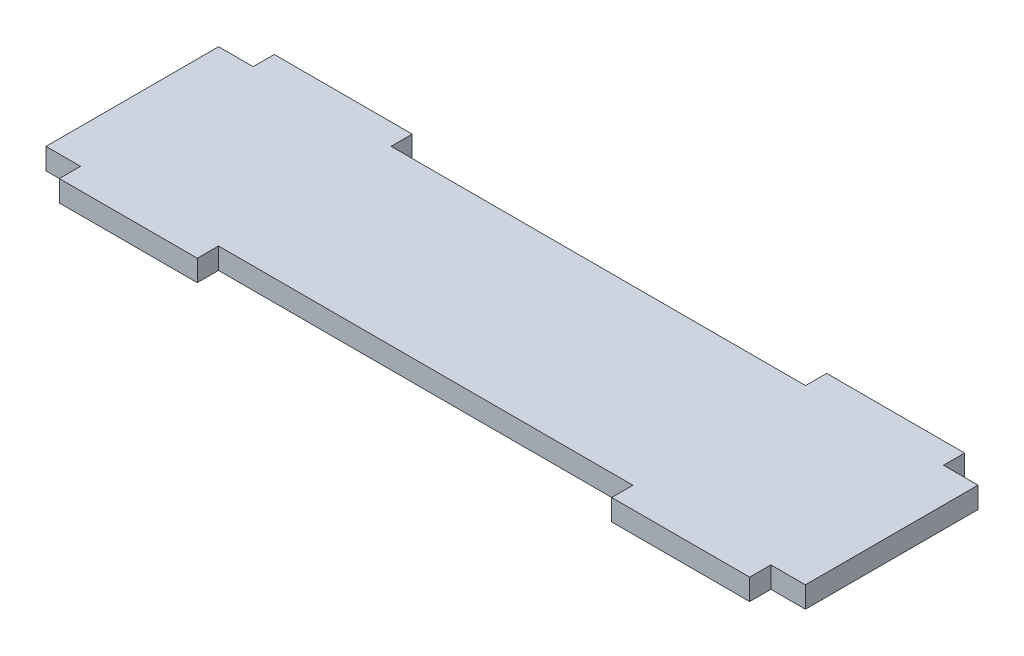
ISO-10303-21;
HEADER;
FILE_DESCRIPTION(('STEP AP214'),'2;1');
FILE_NAME('part.step','',(''),(''),'','','');
FILE_SCHEMA(('AUTOMOTIVE_DESIGN { 1 0 10303 214 1 1 1 1 }'));
ENDSEC;
DATA;
#1=APPLICATION_CONTEXT('core data for automotive mechanical design processes');
#2=APPLICATION_PROTOCOL_DEFINITION('international standard','automotive_design',2000,#1);
#3=PRODUCT_CONTEXT('',#1,'mechanical');
#4=PRODUCT('Part','Part','',(#3));
#5=PRODUCT_RELATED_PRODUCT_CATEGORY('part','',(#4));
#6=PRODUCT_DEFINITION_FORMATION('','',#4);
#7=PRODUCT_DEFINITION_CONTEXT('part definition',#1,'design');
#8=PRODUCT_DEFINITION('design','',#6,#7);
#9=PRODUCT_DEFINITION_SHAPE('','',#8);
#10=(LENGTH_UNIT() NAMED_UNIT(*) SI_UNIT(.MILLI.,.METRE.));
#11=(NAMED_UNIT(*) PLANE_ANGLE_UNIT() SI_UNIT($,.RADIAN.));
#12=(NAMED_UNIT(*) SI_UNIT($,.STERADIAN.) SOLID_ANGLE_UNIT());
#13=UNCERTAINTY_MEASURE_WITH_UNIT(LENGTH_MEASURE(1.E-05),#10,'distance_accuracy_value','');
#14=(GEOMETRIC_REPRESENTATION_CONTEXT(3) GLOBAL_UNCERTAINTY_ASSIGNED_CONTEXT((#13)) GLOBAL_UNIT_ASSIGNED_CONTEXT((#10,
#11,#12)) REPRESENTATION_CONTEXT('',''));
#15=CARTESIAN_POINT('',(0.,0.,0.));
#16=DIRECTION('',(0.,0.,1.));
#17=DIRECTION('',(1.,0.,0.));
#18=AXIS2_PLACEMENT_3D('',#15,#16,#17);
#19=CARTESIAN_POINT('',(-30.01,-51.9,-32.1299999999999));
#20=DIRECTION('',(0.,0.,1.));
#21=DIRECTION('',(1.,0.,0.));
#22=AXIS2_PLACEMENT_3D('',#19,#20,#21);
#23=PLANE('',#22);
#24=DIRECTION('',(1.,0.,0.));
#25=VECTOR('',#24,1.);
#26=CARTESIAN_POINT('',(-30.01,-48.83,-32.1299999999999));
#27=LINE('',#26,#25);
#28=CARTESIAN_POINT('',(-49.99,-48.83,-32.1299999999999));
#29=VERTEX_POINT('',#28);
#30=CARTESIAN_POINT('',(-30.01,-48.83,-32.1299999999999));
#31=VERTEX_POINT('',#30);
#32=EDGE_CURVE('E211',#29,#31,#27,.T.);
#33=ORIENTED_EDGE('',*,*,#32,.T.);
#34=DIRECTION('',(0.,1.,0.));
#35=VECTOR('',#34,1.);
#36=CARTESIAN_POINT('',(-30.01,-51.9,-32.1299999999999));
#37=LINE('',#36,#35);
#38=CARTESIAN_POINT('',(-30.01,-51.9,-32.1299999999999));
#39=VERTEX_POINT('',#38);
#40=EDGE_CURVE('E11',#39,#31,#37,.T.);
#41=ORIENTED_EDGE('',*,*,#40,.F.);
#42=DIRECTION('',(1.,0.,0.));
#43=VECTOR('',#42,1.);
#44=CARTESIAN_POINT('',(-30.01,-51.9,-32.1299999999999));
#45=LINE('',#44,#43);
#46=CARTESIAN_POINT('',(-49.99,-51.9,-32.1299999999999));
#47=VERTEX_POINT('',#46);
#48=EDGE_CURVE('E249',#47,#39,#45,.T.);
#49=ORIENTED_EDGE('',*,*,#48,.F.);
#50=DIRECTION('',(0.,1.,0.));
#51=VECTOR('',#50,1.);
#52=CARTESIAN_POINT('',(-49.99,-51.9,-32.1299999999999));
#53=LINE('',#52,#51);
#54=EDGE_CURVE('E207',#47,#29,#53,.T.);
#55=ORIENTED_EDGE('',*,*,#54,.T.);
#56=EDGE_LOOP('',(#33,#41,#49,#55));
#57=FACE_BOUND('',#56,.T.);
#58=ADVANCED_FACE('F43',(#57),#23,.F.);
#59=CARTESIAN_POINT('',(-30.01,-51.9,-29.07));
#60=DIRECTION('',(-1.,0.,0.));
#61=DIRECTION('',(0.,0.,1.));
#62=AXIS2_PLACEMENT_3D('',#59,#60,#61);
#63=PLANE('',#62);
#64=DIRECTION('',(0.,0.,1.));
#65=VECTOR('',#64,1.);
#66=CARTESIAN_POINT('',(-30.01,-48.83,-29.07));
#67=LINE('',#66,#65);
#68=CARTESIAN_POINT('',(-30.01,-48.83,-29.07));
#69=VERTEX_POINT('',#68);
#70=EDGE_CURVE('E214',#31,#69,#67,.T.);
#71=ORIENTED_EDGE('',*,*,#70,.T.);
#72=DIRECTION('',(0.,1.,0.));
#73=VECTOR('',#72,1.);
#74=CARTESIAN_POINT('',(-30.01,-51.9,-29.07));
#75=LINE('',#74,#73);
#76=CARTESIAN_POINT('',(-30.01,-51.9,-29.07));
#77=VERTEX_POINT('',#76);
#78=EDGE_CURVE('E51',#77,#69,#75,.T.);
#79=ORIENTED_EDGE('',*,*,#78,.F.);
#80=DIRECTION('',(0.,0.,1.));
#81=VECTOR('',#80,1.);
#82=CARTESIAN_POINT('',(-30.01,-51.9,-29.07));
#83=LINE('',#82,#81);
#84=EDGE_CURVE('E138',#39,#77,#83,.T.);
#85=ORIENTED_EDGE('',*,*,#84,.F.);
#86=ORIENTED_EDGE('',*,*,#40,.T.);
#87=EDGE_LOOP('',(#71,#79,#85,#86));
#88=FACE_BOUND('',#87,.T.);
#89=ADVANCED_FACE('F368',(#88),#63,.F.);
#90=CARTESIAN_POINT('',(30.01,-51.9,-29.07));
#91=DIRECTION('',(0.,0.,1.));
#92=DIRECTION('',(1.,0.,0.));
#93=AXIS2_PLACEMENT_3D('',#90,#91,#92);
#94=PLANE('',#93);
#95=DIRECTION('',(1.,0.,0.));
#96=VECTOR('',#95,1.);
#97=CARTESIAN_POINT('',(30.01,-48.83,-29.07));
#98=LINE('',#97,#96);
#99=CARTESIAN_POINT('',(30.01,-48.83,-29.07));
#100=VERTEX_POINT('',#99);
#101=EDGE_CURVE('E216',#69,#100,#98,.T.);
#102=ORIENTED_EDGE('',*,*,#101,.T.);
#103=DIRECTION('',(0.,1.,0.));
#104=VECTOR('',#103,1.);
#105=CARTESIAN_POINT('',(30.01,-51.9,-29.07));
#106=LINE('',#105,#104);
#107=CARTESIAN_POINT('',(30.01,-51.9,-29.07));
#108=VERTEX_POINT('',#107);
#109=EDGE_CURVE('E292',#108,#100,#106,.T.);
#110=ORIENTED_EDGE('',*,*,#109,.F.);
#111=DIRECTION('',(1.,0.,0.));
#112=VECTOR('',#111,1.);
#113=CARTESIAN_POINT('',(30.01,-51.9,-29.07));
#114=LINE('',#113,#112);
#115=EDGE_CURVE('E300',#77,#108,#114,.T.);
#116=ORIENTED_EDGE('',*,*,#115,.F.);
#117=ORIENTED_EDGE('',*,*,#78,.T.);
#118=EDGE_LOOP('',(#102,#110,#116,#117));
#119=FACE_BOUND('',#118,.T.);
#120=ADVANCED_FACE('F298',(#119),#94,.F.);
#121=CARTESIAN_POINT('',(30.01,-51.9,-32.1299999999999));
#122=DIRECTION('',(1.,0.,0.));
#123=DIRECTION('',(0.,0.,-1.));
#124=AXIS2_PLACEMENT_3D('',#121,#122,#123);
#125=PLANE('',#124);
#126=DIRECTION('',(0.,0.,-1.));
#127=VECTOR('',#126,1.);
#128=CARTESIAN_POINT('',(30.01,-48.83,-32.1299999999999));
#129=LINE('',#128,#127);
#130=CARTESIAN_POINT('',(30.01,-48.83,-32.1299999999999));
#131=VERTEX_POINT('',#130);
#132=EDGE_CURVE('E218',#100,#131,#129,.T.);
#133=ORIENTED_EDGE('',*,*,#132,.T.);
#134=DIRECTION('',(0.,1.,0.));
#135=VECTOR('',#134,1.);
#136=CARTESIAN_POINT('',(30.01,-51.9,-32.1299999999999));
#137=LINE('',#136,#135);
#138=CARTESIAN_POINT('',(30.01,-51.9,-32.1299999999999));
#139=VERTEX_POINT('',#138);
#140=EDGE_CURVE('E289',#139,#131,#137,.T.);
#141=ORIENTED_EDGE('',*,*,#140,.F.);
#142=DIRECTION('',(0.,0.,-1.));
#143=VECTOR('',#142,1.);
#144=CARTESIAN_POINT('',(30.01,-51.9,-32.1299999999999));
#145=LINE('',#144,#143);
#146=EDGE_CURVE('E318',#108,#139,#145,.T.);
#147=ORIENTED_EDGE('',*,*,#146,.F.);
#148=ORIENTED_EDGE('',*,*,#109,.T.);
#149=EDGE_LOOP('',(#133,#141,#147,#148));
#150=FACE_BOUND('',#149,.T.);
#151=ADVANCED_FACE('F309',(#150),#125,.F.);
#152=CARTESIAN_POINT('',(49.99,-51.9,-32.1299999999999));
#153=DIRECTION('',(0.,0.,1.));
#154=DIRECTION('',(1.,0.,0.));
#155=AXIS2_PLACEMENT_3D('',#152,#153,#154);
#156=PLANE('',#155);
#157=DIRECTION('',(1.,0.,0.));
#158=VECTOR('',#157,1.);
#159=CARTESIAN_POINT('',(49.99,-48.83,-32.1299999999999));
#160=LINE('',#159,#158);
#161=CARTESIAN_POINT('',(49.99,-48.83,-32.1299999999999));
#162=VERTEX_POINT('',#161);
#163=EDGE_CURVE('E220',#131,#162,#160,.T.);
#164=ORIENTED_EDGE('',*,*,#163,.T.);
#165=DIRECTION('',(0.,1.,0.));
#166=VECTOR('',#165,1.);
#167=CARTESIAN_POINT('',(49.99,-51.9,-32.1299999999999));
#168=LINE('',#167,#166);
#169=CARTESIAN_POINT('',(49.99,-51.9,-32.1299999999999));
#170=VERTEX_POINT('',#169);
#171=EDGE_CURVE('E286',#170,#162,#168,.T.);
#172=ORIENTED_EDGE('',*,*,#171,.F.);
#173=DIRECTION('',(1.,0.,0.));
#174=VECTOR('',#173,1.);
#175=CARTESIAN_POINT('',(49.99,-51.9,-32.1299999999999));
#176=LINE('',#175,#174);
#177=EDGE_CURVE('E315',#139,#170,#176,.T.);
#178=ORIENTED_EDGE('',*,*,#177,.F.);
#179=ORIENTED_EDGE('',*,*,#140,.T.);
#180=EDGE_LOOP('',(#164,#172,#178,#179));
#181=FACE_BOUND('',#180,.T.);
#182=ADVANCED_FACE('F313',(#181),#156,.F.);
#183=CARTESIAN_POINT('',(49.99,-51.9,-29.07));
#184=DIRECTION('',(-1.,0.,0.));
#185=DIRECTION('',(0.,0.,1.));
#186=AXIS2_PLACEMENT_3D('',#183,#184,#185);
#187=PLANE('',#186);
#188=DIRECTION('',(0.,0.,1.));
#189=VECTOR('',#188,1.);
#190=CARTESIAN_POINT('',(49.99,-48.83,-29.07));
#191=LINE('',#190,#189);
#192=CARTESIAN_POINT('',(49.99,-48.83,-29.07));
#193=VERTEX_POINT('',#192);
#194=EDGE_CURVE('E222',#162,#193,#191,.T.);
#195=ORIENTED_EDGE('',*,*,#194,.T.);
#196=DIRECTION('',(0.,1.,0.));
#197=VECTOR('',#196,1.);
#198=CARTESIAN_POINT('',(49.99,-51.9,-29.07));
#199=LINE('',#198,#197);
#200=CARTESIAN_POINT('',(49.99,-51.9,-29.07));
#201=VERTEX_POINT('',#200);
#202=EDGE_CURVE('E283',#201,#193,#199,.T.);
#203=ORIENTED_EDGE('',*,*,#202,.F.);
#204=DIRECTION('',(0.,0.,1.));
#205=VECTOR('',#204,1.);
#206=CARTESIAN_POINT('',(49.99,-51.9,-29.07));
#207=LINE('',#206,#205);
#208=EDGE_CURVE('E317',#170,#201,#207,.T.);
#209=ORIENTED_EDGE('',*,*,#208,.F.);
#210=ORIENTED_EDGE('',*,*,#171,.T.);
#211=EDGE_LOOP('',(#195,#203,#209,#210));
#212=FACE_BOUND('',#211,.T.);
#213=ADVANCED_FACE('F383',(#212),#187,.F.);
#214=CARTESIAN_POINT('',(54.99,-51.9,-29.07));
#215=DIRECTION('',(0.,0.,1.));
#216=DIRECTION('',(1.,0.,0.));
#217=AXIS2_PLACEMENT_3D('',#214,#215,#216);
#218=PLANE('',#217);
#219=DIRECTION('',(1.,0.,0.));
#220=VECTOR('',#219,1.);
#221=CARTESIAN_POINT('',(54.99,-48.83,-29.07));
#222=LINE('',#221,#220);
#223=CARTESIAN_POINT('',(54.99,-48.83,-29.07));
#224=VERTEX_POINT('',#223);
#225=EDGE_CURVE('E224',#193,#224,#222,.T.);
#226=ORIENTED_EDGE('',*,*,#225,.T.);
#227=DIRECTION('',(0.,1.,0.));
#228=VECTOR('',#227,1.);
#229=CARTESIAN_POINT('',(54.99,-51.9,-29.07));
#230=LINE('',#229,#228);
#231=CARTESIAN_POINT('',(54.99,-51.9,-29.07));
#232=VERTEX_POINT('',#231);
#233=EDGE_CURVE('E280',#232,#224,#230,.T.);
#234=ORIENTED_EDGE('',*,*,#233,.F.);
#235=DIRECTION('',(1.,0.,0.));
#236=VECTOR('',#235,1.);
#237=CARTESIAN_POINT('',(54.99,-51.9,-29.07));
#238=LINE('',#237,#236);
#239=EDGE_CURVE('E320',#201,#232,#238,.T.);
#240=ORIENTED_EDGE('',*,*,#239,.F.);
#241=ORIENTED_EDGE('',*,*,#202,.T.);
#242=EDGE_LOOP('',(#226,#234,#240,#241));
#243=FACE_BOUND('',#242,.T.);
#244=ADVANCED_FACE('F386',(#243),#218,.F.);
#245=CARTESIAN_POINT('',(54.99,-51.9,-4.07));
#246=DIRECTION('',(-1.,0.,0.));
#247=DIRECTION('',(0.,0.,1.));
#248=AXIS2_PLACEMENT_3D('',#245,#246,#247);
#249=PLANE('',#248);
#250=DIRECTION('',(0.,0.,1.));
#251=VECTOR('',#250,1.);
#252=CARTESIAN_POINT('',(54.99,-48.83,-4.07));
#253=LINE('',#252,#251);
#254=CARTESIAN_POINT('',(54.99,-48.83,-4.07));
#255=VERTEX_POINT('',#254);
#256=EDGE_CURVE('E226',#224,#255,#253,.T.);
#257=ORIENTED_EDGE('',*,*,#256,.T.);
#258=DIRECTION('',(0.,1.,0.));
#259=VECTOR('',#258,1.);
#260=CARTESIAN_POINT('',(54.99,-51.9,-4.07));
#261=LINE('',#260,#259);
#262=CARTESIAN_POINT('',(54.99,-51.9,-4.07));
#263=VERTEX_POINT('',#262);
#264=EDGE_CURVE('E277',#263,#255,#261,.T.);
#265=ORIENTED_EDGE('',*,*,#264,.F.);
#266=DIRECTION('',(0.,0.,1.));
#267=VECTOR('',#266,1.);
#268=CARTESIAN_POINT('',(54.99,-51.9,-4.07));
#269=LINE('',#268,#267);
#270=EDGE_CURVE('E326',#232,#263,#269,.T.);
#271=ORIENTED_EDGE('',*,*,#270,.F.);
#272=ORIENTED_EDGE('',*,*,#233,.T.);
#273=EDGE_LOOP('',(#257,#265,#271,#272));
#274=FACE_BOUND('',#273,.T.);
#275=ADVANCED_FACE('F390',(#274),#249,.F.);
#276=CARTESIAN_POINT('',(49.99,-51.9,-4.07));
#277=DIRECTION('',(0.,0.,-1.));
#278=DIRECTION('',(-1.,0.,0.));
#279=AXIS2_PLACEMENT_3D('',#276,#277,#278);
#280=PLANE('',#279);
#281=DIRECTION('',(-1.,0.,0.));
#282=VECTOR('',#281,1.);
#283=CARTESIAN_POINT('',(49.99,-48.83,-4.07));
#284=LINE('',#283,#282);
#285=CARTESIAN_POINT('',(49.99,-48.83,-4.07));
#286=VERTEX_POINT('',#285);
#287=EDGE_CURVE('E228',#255,#286,#284,.T.);
#288=ORIENTED_EDGE('',*,*,#287,.T.);
#289=DIRECTION('',(0.,1.,0.));
#290=VECTOR('',#289,1.);
#291=CARTESIAN_POINT('',(49.99,-51.9,-4.07));
#292=LINE('',#291,#290);
#293=CARTESIAN_POINT('',(49.99,-51.9,-4.07));
#294=VERTEX_POINT('',#293);
#295=EDGE_CURVE('E274',#294,#286,#292,.T.);
#296=ORIENTED_EDGE('',*,*,#295,.F.);
#297=DIRECTION('',(-1.,0.,0.));
#298=VECTOR('',#297,1.);
#299=CARTESIAN_POINT('',(49.99,-51.9,-4.07));
#300=LINE('',#299,#298);
#301=EDGE_CURVE('E328',#263,#294,#300,.T.);
#302=ORIENTED_EDGE('',*,*,#301,.F.);
#303=ORIENTED_EDGE('',*,*,#264,.T.);
#304=EDGE_LOOP('',(#288,#296,#302,#303));
#305=FACE_BOUND('',#304,.T.);
#306=ADVANCED_FACE('F394',(#305),#280,.F.);
#307=CARTESIAN_POINT('',(49.99,-51.9,-1.));
#308=DIRECTION('',(-1.,0.,0.));
#309=DIRECTION('',(0.,0.,1.));
#310=AXIS2_PLACEMENT_3D('',#307,#308,#309);
#311=PLANE('',#310);
#312=DIRECTION('',(0.,0.,1.));
#313=VECTOR('',#312,1.);
#314=CARTESIAN_POINT('',(49.99,-48.83,-1.));
#315=LINE('',#314,#313);
#316=CARTESIAN_POINT('',(49.99,-48.83,-1.));
#317=VERTEX_POINT('',#316);
#318=EDGE_CURVE('E230',#286,#317,#315,.T.);
#319=ORIENTED_EDGE('',*,*,#318,.T.);
#320=DIRECTION('',(0.,1.,0.));
#321=VECTOR('',#320,1.);
#322=CARTESIAN_POINT('',(49.99,-51.9,-1.));
#323=LINE('',#322,#321);
#324=CARTESIAN_POINT('',(49.99,-51.9,-1.));
#325=VERTEX_POINT('',#324);
#326=EDGE_CURVE('E271',#325,#317,#323,.T.);
#327=ORIENTED_EDGE('',*,*,#326,.F.);
#328=DIRECTION('',(0.,0.,1.));
#329=VECTOR('',#328,1.);
#330=CARTESIAN_POINT('',(49.99,-51.9,-1.));
#331=LINE('',#330,#329);
#332=EDGE_CURVE('E330',#294,#325,#331,.T.);
#333=ORIENTED_EDGE('',*,*,#332,.F.);
#334=ORIENTED_EDGE('',*,*,#295,.T.);
#335=EDGE_LOOP('',(#319,#327,#333,#334));
#336=FACE_BOUND('',#335,.T.);
#337=ADVANCED_FACE('F398',(#336),#311,.F.);
#338=CARTESIAN_POINT('',(30.01,-51.9,-1.));
#339=DIRECTION('',(0.,0.,-1.));
#340=DIRECTION('',(-1.,0.,0.));
#341=AXIS2_PLACEMENT_3D('',#338,#339,#340);
#342=PLANE('',#341);
#343=DIRECTION('',(-1.,0.,0.));
#344=VECTOR('',#343,1.);
#345=CARTESIAN_POINT('',(30.01,-48.83,-1.));
#346=LINE('',#345,#344);
#347=CARTESIAN_POINT('',(30.01,-48.83,-1.));
#348=VERTEX_POINT('',#347);
#349=EDGE_CURVE('E232',#317,#348,#346,.T.);
#350=ORIENTED_EDGE('',*,*,#349,.T.);
#351=DIRECTION('',(0.,1.,0.));
#352=VECTOR('',#351,1.);
#353=CARTESIAN_POINT('',(30.01,-51.9,-1.));
#354=LINE('',#353,#352);
#355=CARTESIAN_POINT('',(30.01,-51.9,-1.));
#356=VERTEX_POINT('',#355);
#357=EDGE_CURVE('E268',#356,#348,#354,.T.);
#358=ORIENTED_EDGE('',*,*,#357,.F.);
#359=DIRECTION('',(-1.,0.,0.));
#360=VECTOR('',#359,1.);
#361=CARTESIAN_POINT('',(30.01,-51.9,-1.));
#362=LINE('',#361,#360);
#363=EDGE_CURVE('E332',#325,#356,#362,.T.);
#364=ORIENTED_EDGE('',*,*,#363,.F.);
#365=ORIENTED_EDGE('',*,*,#326,.T.);
#366=EDGE_LOOP('',(#350,#358,#364,#365));
#367=FACE_BOUND('',#366,.T.);
#368=ADVANCED_FACE('F402',(#367),#342,.F.);
#369=CARTESIAN_POINT('',(30.01,-51.9,-4.07));
#370=DIRECTION('',(1.,0.,0.));
#371=DIRECTION('',(0.,0.,-1.));
#372=AXIS2_PLACEMENT_3D('',#369,#370,#371);
#373=PLANE('',#372);
#374=DIRECTION('',(0.,0.,-1.));
#375=VECTOR('',#374,1.);
#376=CARTESIAN_POINT('',(30.01,-48.83,-4.07));
#377=LINE('',#376,#375);
#378=CARTESIAN_POINT('',(30.01,-48.83,-4.07));
#379=VERTEX_POINT('',#378);
#380=EDGE_CURVE('E234',#348,#379,#377,.T.);
#381=ORIENTED_EDGE('',*,*,#380,.T.);
#382=DIRECTION('',(0.,1.,0.));
#383=VECTOR('',#382,1.);
#384=CARTESIAN_POINT('',(30.01,-51.9,-4.07));
#385=LINE('',#384,#383);
#386=CARTESIAN_POINT('',(30.01,-51.9,-4.07));
#387=VERTEX_POINT('',#386);
#388=EDGE_CURVE('E265',#387,#379,#385,.T.);
#389=ORIENTED_EDGE('',*,*,#388,.F.);
#390=DIRECTION('',(0.,0.,-1.));
#391=VECTOR('',#390,1.);
#392=CARTESIAN_POINT('',(30.01,-51.9,-4.07));
#393=LINE('',#392,#391);
#394=EDGE_CURVE('E334',#356,#387,#393,.T.);
#395=ORIENTED_EDGE('',*,*,#394,.F.);
#396=ORIENTED_EDGE('',*,*,#357,.T.);
#397=EDGE_LOOP('',(#381,#389,#395,#396));
#398=FACE_BOUND('',#397,.T.);
#399=ADVANCED_FACE('F406',(#398),#373,.F.);
#400=CARTESIAN_POINT('',(-30.01,-51.9,-4.07));
#401=DIRECTION('',(0.,0.,-1.));
#402=DIRECTION('',(-1.,0.,0.));
#403=AXIS2_PLACEMENT_3D('',#400,#401,#402);
#404=PLANE('',#403);
#405=DIRECTION('',(-1.,0.,0.));
#406=VECTOR('',#405,1.);
#407=CARTESIAN_POINT('',(-30.01,-48.83,-4.07));
#408=LINE('',#407,#406);
#409=CARTESIAN_POINT('',(-30.01,-48.83,-4.07));
#410=VERTEX_POINT('',#409);
#411=EDGE_CURVE('E236',#379,#410,#408,.T.);
#412=ORIENTED_EDGE('',*,*,#411,.T.);
#413=DIRECTION('',(0.,1.,0.));
#414=VECTOR('',#413,1.);
#415=CARTESIAN_POINT('',(-30.01,-51.9,-4.07));
#416=LINE('',#415,#414);
#417=CARTESIAN_POINT('',(-30.01,-51.9,-4.07));
#418=VERTEX_POINT('',#417);
#419=EDGE_CURVE('E262',#418,#410,#416,.T.);
#420=ORIENTED_EDGE('',*,*,#419,.F.);
#421=DIRECTION('',(-1.,0.,0.));
#422=VECTOR('',#421,1.);
#423=CARTESIAN_POINT('',(-30.01,-51.9,-4.07));
#424=LINE('',#423,#422);
#425=EDGE_CURVE('E336',#387,#418,#424,.T.);
#426=ORIENTED_EDGE('',*,*,#425,.F.);
#427=ORIENTED_EDGE('',*,*,#388,.T.);
#428=EDGE_LOOP('',(#412,#420,#426,#427));
#429=FACE_BOUND('',#428,.T.);
#430=ADVANCED_FACE('F410',(#429),#404,.F.);
#431=CARTESIAN_POINT('',(-30.01,-51.9,-1.));
#432=DIRECTION('',(-1.,0.,0.));
#433=DIRECTION('',(0.,0.,1.));
#434=AXIS2_PLACEMENT_3D('',#431,#432,#433);
#435=PLANE('',#434);
#436=DIRECTION('',(0.,0.,1.));
#437=VECTOR('',#436,1.);
#438=CARTESIAN_POINT('',(-30.01,-48.83,-1.));
#439=LINE('',#438,#437);
#440=CARTESIAN_POINT('',(-30.01,-48.83,-1.));
#441=VERTEX_POINT('',#440);
#442=EDGE_CURVE('E238',#410,#441,#439,.T.);
#443=ORIENTED_EDGE('',*,*,#442,.T.);
#444=DIRECTION('',(0.,1.,0.));
#445=VECTOR('',#444,1.);
#446=CARTESIAN_POINT('',(-30.01,-51.9,-1.));
#447=LINE('',#446,#445);
#448=CARTESIAN_POINT('',(-30.01,-51.9,-1.));
#449=VERTEX_POINT('',#448);
#450=EDGE_CURVE('E259',#449,#441,#447,.T.);
#451=ORIENTED_EDGE('',*,*,#450,.F.);
#452=DIRECTION('',(0.,0.,1.));
#453=VECTOR('',#452,1.);
#454=CARTESIAN_POINT('',(-30.01,-51.9,-1.));
#455=LINE('',#454,#453);
#456=EDGE_CURVE('E338',#418,#449,#455,.T.);
#457=ORIENTED_EDGE('',*,*,#456,.F.);
#458=ORIENTED_EDGE('',*,*,#419,.T.);
#459=EDGE_LOOP('',(#443,#451,#457,#458));
#460=FACE_BOUND('',#459,.T.);
#461=ADVANCED_FACE('F414',(#460),#435,.F.);
#462=CARTESIAN_POINT('',(-49.99,-51.9,-1.));
#463=DIRECTION('',(0.,0.,-1.));
#464=DIRECTION('',(-1.,0.,0.));
#465=AXIS2_PLACEMENT_3D('',#462,#463,#464);
#466=PLANE('',#465);
#467=DIRECTION('',(-1.,0.,0.));
#468=VECTOR('',#467,1.);
#469=CARTESIAN_POINT('',(-49.99,-48.83,-1.));
#470=LINE('',#469,#468);
#471=CARTESIAN_POINT('',(-49.99,-48.83,-1.));
#472=VERTEX_POINT('',#471);
#473=EDGE_CURVE('E240',#441,#472,#470,.T.);
#474=ORIENTED_EDGE('',*,*,#473,.T.);
#475=DIRECTION('',(0.,1.,0.));
#476=VECTOR('',#475,1.);
#477=CARTESIAN_POINT('',(-49.99,-51.9,-1.));
#478=LINE('',#477,#476);
#479=CARTESIAN_POINT('',(-49.99,-51.9,-1.));
#480=VERTEX_POINT('',#479);
#481=EDGE_CURVE('E256',#480,#472,#478,.T.);
#482=ORIENTED_EDGE('',*,*,#481,.F.);
#483=DIRECTION('',(-1.,0.,0.));
#484=VECTOR('',#483,1.);
#485=CARTESIAN_POINT('',(-49.99,-51.9,-1.));
#486=LINE('',#485,#484);
#487=EDGE_CURVE('E340',#449,#480,#486,.T.);
#488=ORIENTED_EDGE('',*,*,#487,.F.);
#489=ORIENTED_EDGE('',*,*,#450,.T.);
#490=EDGE_LOOP('',(#474,#482,#488,#489));
#491=FACE_BOUND('',#490,.T.);
#492=ADVANCED_FACE('F418',(#491),#466,.F.);
#493=CARTESIAN_POINT('',(-49.99,-51.9,-4.07));
#494=DIRECTION('',(1.,0.,0.));
#495=DIRECTION('',(0.,0.,-1.));
#496=AXIS2_PLACEMENT_3D('',#493,#494,#495);
#497=PLANE('',#496);
#498=DIRECTION('',(0.,0.,-1.));
#499=VECTOR('',#498,1.);
#500=CARTESIAN_POINT('',(-49.99,-48.83,-4.07));
#501=LINE('',#500,#499);
#502=CARTESIAN_POINT('',(-49.99,-48.83,-4.07));
#503=VERTEX_POINT('',#502);
#504=EDGE_CURVE('E242',#472,#503,#501,.T.);
#505=ORIENTED_EDGE('',*,*,#504,.T.);
#506=DIRECTION('',(0.,1.,0.));
#507=VECTOR('',#506,1.);
#508=CARTESIAN_POINT('',(-49.99,-51.9,-4.07));
#509=LINE('',#508,#507);
#510=CARTESIAN_POINT('',(-49.99,-51.9,-4.07));
#511=VERTEX_POINT('',#510);
#512=EDGE_CURVE('E253',#511,#503,#509,.T.);
#513=ORIENTED_EDGE('',*,*,#512,.F.);
#514=DIRECTION('',(0.,0.,-1.));
#515=VECTOR('',#514,1.);
#516=CARTESIAN_POINT('',(-49.99,-51.9,-4.07));
#517=LINE('',#516,#515);
#518=EDGE_CURVE('E342',#480,#511,#517,.T.);
#519=ORIENTED_EDGE('',*,*,#518,.F.);
#520=ORIENTED_EDGE('',*,*,#481,.T.);
#521=EDGE_LOOP('',(#505,#513,#519,#520));
#522=FACE_BOUND('',#521,.T.);
#523=ADVANCED_FACE('F348',(#522),#497,.F.);
#524=CARTESIAN_POINT('',(-54.99,-51.9,-4.07));
#525=DIRECTION('',(0.,0.,-1.));
#526=DIRECTION('',(-1.,0.,0.));
#527=AXIS2_PLACEMENT_3D('',#524,#525,#526);
#528=PLANE('',#527);
#529=DIRECTION('',(-1.,0.,0.));
#530=VECTOR('',#529,1.);
#531=CARTESIAN_POINT('',(-54.99,-48.83,-4.07));
#532=LINE('',#531,#530);
#533=CARTESIAN_POINT('',(-54.99,-48.83,-4.07));
#534=VERTEX_POINT('',#533);
#535=EDGE_CURVE('E244',#503,#534,#532,.T.);
#536=ORIENTED_EDGE('',*,*,#535,.T.);
#537=DIRECTION('',(0.,1.,0.));
#538=VECTOR('',#537,1.);
#539=CARTESIAN_POINT('',(-54.99,-51.9,-4.07));
#540=LINE('',#539,#538);
#541=CARTESIAN_POINT('',(-54.99,-51.9,-4.07));
#542=VERTEX_POINT('',#541);
#543=EDGE_CURVE('E202',#542,#534,#540,.T.);
#544=ORIENTED_EDGE('',*,*,#543,.F.);
#545=DIRECTION('',(-1.,0.,0.));
#546=VECTOR('',#545,1.);
#547=CARTESIAN_POINT('',(-54.99,-51.9,-4.07));
#548=LINE('',#547,#546);
#549=EDGE_CURVE('E193',#511,#542,#548,.T.);
#550=ORIENTED_EDGE('',*,*,#549,.F.);
#551=ORIENTED_EDGE('',*,*,#512,.T.);
#552=EDGE_LOOP('',(#536,#544,#550,#551));
#553=FACE_BOUND('',#552,.T.);
#554=ADVANCED_FACE('F352',(#553),#528,.F.);
#555=CARTESIAN_POINT('',(-54.99,-51.9,-29.0699999999999));
#556=DIRECTION('',(1.,0.,0.));
#557=DIRECTION('',(0.,0.,-1.));
#558=AXIS2_PLACEMENT_3D('',#555,#556,#557);
#559=PLANE('',#558);
#560=DIRECTION('',(0.,0.,-1.));
#561=VECTOR('',#560,1.);
#562=CARTESIAN_POINT('',(-54.99,-48.83,-29.0699999999999));
#563=LINE('',#562,#561);
#564=CARTESIAN_POINT('',(-54.99,-48.83,-29.0699999999999));
#565=VERTEX_POINT('',#564);
#566=EDGE_CURVE('E201',#534,#565,#563,.T.);
#567=ORIENTED_EDGE('',*,*,#566,.T.);
#568=DIRECTION('',(0.,1.,0.));
#569=VECTOR('',#568,1.);
#570=CARTESIAN_POINT('',(-54.99,-51.9,-29.0699999999999));
#571=LINE('',#570,#569);
#572=CARTESIAN_POINT('',(-54.99,-51.9,-29.0699999999999));
#573=VERTEX_POINT('',#572);
#574=EDGE_CURVE('E198',#573,#565,#571,.T.);
#575=ORIENTED_EDGE('',*,*,#574,.F.);
#576=DIRECTION('',(0.,0.,-1.));
#577=VECTOR('',#576,1.);
#578=CARTESIAN_POINT('',(-54.99,-51.9,-29.0699999999999));
#579=LINE('',#578,#577);
#580=EDGE_CURVE('E187',#542,#573,#579,.T.);
#581=ORIENTED_EDGE('',*,*,#580,.F.);
#582=ORIENTED_EDGE('',*,*,#543,.T.);
#583=EDGE_LOOP('',(#567,#575,#581,#582));
#584=FACE_BOUND('',#583,.T.);
#585=ADVANCED_FACE('F199',(#584),#559,.F.);
#586=CARTESIAN_POINT('',(-49.99,-51.9,-29.0699999999999));
#587=DIRECTION('',(0.,0.,1.));
#588=DIRECTION('',(1.,0.,0.));
#589=AXIS2_PLACEMENT_3D('',#586,#587,#588);
#590=PLANE('',#589);
#591=DIRECTION('',(1.,0.,0.));
#592=VECTOR('',#591,1.);
#593=CARTESIAN_POINT('',(-49.99,-48.83,-29.0699999999999));
#594=LINE('',#593,#592);
#595=CARTESIAN_POINT('',(-49.99,-48.83,-29.0699999999999));
#596=VERTEX_POINT('',#595);
#597=EDGE_CURVE('E124',#565,#596,#594,.T.);
#598=ORIENTED_EDGE('',*,*,#597,.T.);
#599=DIRECTION('',(0.,1.,0.));
#600=VECTOR('',#599,1.);
#601=CARTESIAN_POINT('',(-49.99,-51.9,-29.0699999999999));
#602=LINE('',#601,#600);
#603=CARTESIAN_POINT('',(-49.99,-51.9,-29.0699999999999));
#604=VERTEX_POINT('',#603);
#605=EDGE_CURVE('E203',#604,#596,#602,.T.);
#606=ORIENTED_EDGE('',*,*,#605,.F.);
#607=DIRECTION('',(1.,0.,0.));
#608=VECTOR('',#607,1.);
#609=CARTESIAN_POINT('',(-49.99,-51.9,-29.0699999999999));
#610=LINE('',#609,#608);
#611=EDGE_CURVE('E191',#573,#604,#610,.T.);
#612=ORIENTED_EDGE('',*,*,#611,.F.);
#613=ORIENTED_EDGE('',*,*,#574,.T.);
#614=EDGE_LOOP('',(#598,#606,#612,#613));
#615=FACE_BOUND('',#614,.T.);
#616=ADVANCED_FACE('F205',(#615),#590,.F.);
#617=CARTESIAN_POINT('',(-49.99,-51.9,-32.1299999999999));
#618=DIRECTION('',(1.,0.,0.));
#619=DIRECTION('',(0.,0.,-1.));
#620=AXIS2_PLACEMENT_3D('',#617,#618,#619);
#621=PLANE('',#620);
#622=DIRECTION('',(0.,0.,-1.));
#623=VECTOR('',#622,1.);
#624=CARTESIAN_POINT('',(-49.99,-48.83,-32.1299999999999));
#625=LINE('',#624,#623);
#626=EDGE_CURVE('E130',#596,#29,#625,.T.);
#627=ORIENTED_EDGE('',*,*,#626,.T.);
#628=ORIENTED_EDGE('',*,*,#54,.F.);
#629=DIRECTION('',(0.,0.,-1.));
#630=VECTOR('',#629,1.);
#631=CARTESIAN_POINT('',(-49.99,-51.9,-32.1299999999999));
#632=LINE('',#631,#630);
#633=EDGE_CURVE('E59',#604,#47,#632,.T.);
#634=ORIENTED_EDGE('',*,*,#633,.F.);
#635=ORIENTED_EDGE('',*,*,#605,.T.);
#636=EDGE_LOOP('',(#627,#628,#634,#635));
#637=FACE_BOUND('',#636,.T.);
#638=ADVANCED_FACE('F356',(#637),#621,.F.);
#639=CARTESIAN_POINT('',(0.,-51.9,0.));
#640=DIRECTION('',(0.,1.,0.));
#641=DIRECTION('',(0.,0.,1.));
#642=AXIS2_PLACEMENT_3D('',#639,#640,#641);
#643=PLANE('',#642);
#644=ORIENTED_EDGE('',*,*,#48,.T.);
#645=ORIENTED_EDGE('',*,*,#84,.T.);
#646=ORIENTED_EDGE('',*,*,#115,.T.);
#647=ORIENTED_EDGE('',*,*,#146,.T.);
#648=ORIENTED_EDGE('',*,*,#177,.T.);
#649=ORIENTED_EDGE('',*,*,#208,.T.);
#650=ORIENTED_EDGE('',*,*,#239,.T.);
#651=ORIENTED_EDGE('',*,*,#270,.T.);
#652=ORIENTED_EDGE('',*,*,#301,.T.);
#653=ORIENTED_EDGE('',*,*,#332,.T.);
#654=ORIENTED_EDGE('',*,*,#363,.T.);
#655=ORIENTED_EDGE('',*,*,#394,.T.);
#656=ORIENTED_EDGE('',*,*,#425,.T.);
#657=ORIENTED_EDGE('',*,*,#456,.T.);
#658=ORIENTED_EDGE('',*,*,#487,.T.);
#659=ORIENTED_EDGE('',*,*,#518,.T.);
#660=ORIENTED_EDGE('',*,*,#549,.T.);
#661=ORIENTED_EDGE('',*,*,#580,.T.);
#662=ORIENTED_EDGE('',*,*,#611,.T.);
#663=ORIENTED_EDGE('',*,*,#633,.T.);
#664=EDGE_LOOP('',(#644,#645,#646,#647,#648,#649,#650,#651,#652,#653,#654,#655,#656,#657,#658,
#659,#660,#661,#662,#663));
#665=FACE_BOUND('',#664,.T.);
#666=ADVANCED_FACE('F189',(#665),#643,.F.);
#667=CARTESIAN_POINT('',(0.,-48.83,0.));
#668=DIRECTION('',(0.,1.,0.));
#669=DIRECTION('',(0.,0.,1.));
#670=AXIS2_PLACEMENT_3D('',#667,#668,#669);
#671=PLANE('',#670);
#672=ORIENTED_EDGE('',*,*,#32,.F.);
#673=ORIENTED_EDGE('',*,*,#626,.F.);
#674=ORIENTED_EDGE('',*,*,#597,.F.);
#675=ORIENTED_EDGE('',*,*,#566,.F.);
#676=ORIENTED_EDGE('',*,*,#535,.F.);
#677=ORIENTED_EDGE('',*,*,#504,.F.);
#678=ORIENTED_EDGE('',*,*,#473,.F.);
#679=ORIENTED_EDGE('',*,*,#442,.F.);
#680=ORIENTED_EDGE('',*,*,#411,.F.);
#681=ORIENTED_EDGE('',*,*,#380,.F.);
#682=ORIENTED_EDGE('',*,*,#349,.F.);
#683=ORIENTED_EDGE('',*,*,#318,.F.);
#684=ORIENTED_EDGE('',*,*,#287,.F.);
#685=ORIENTED_EDGE('',*,*,#256,.F.);
#686=ORIENTED_EDGE('',*,*,#225,.F.);
#687=ORIENTED_EDGE('',*,*,#194,.F.);
#688=ORIENTED_EDGE('',*,*,#163,.F.);
#689=ORIENTED_EDGE('',*,*,#132,.F.);
#690=ORIENTED_EDGE('',*,*,#101,.F.);
#691=ORIENTED_EDGE('',*,*,#70,.F.);
#692=EDGE_LOOP('',(#672,#673,#674,#675,#676,#677,#678,#679,#680,#681,#682,#683,#684,#685,#686,
#687,#688,#689,#690,#691));
#693=FACE_BOUND('',#692,.T.);
#694=ADVANCED_FACE('F304',(#693),#671,.T.);
#695=CLOSED_SHELL('',(#58,#89,#120,#151,#182,#213,#244,#275,#306,#337,#368,#399,#430,#461,#492,
#523,#554,#585,#616,#638,#666,#694));
#696=MANIFOLD_SOLID_BREP('B2',#695);
#697=ADVANCED_BREP_SHAPE_REPRESENTATION('',(#18,#696),#14);
#698=SHAPE_DEFINITION_REPRESENTATION(#9,#697);
ENDSEC;
END-ISO-10303-21;
